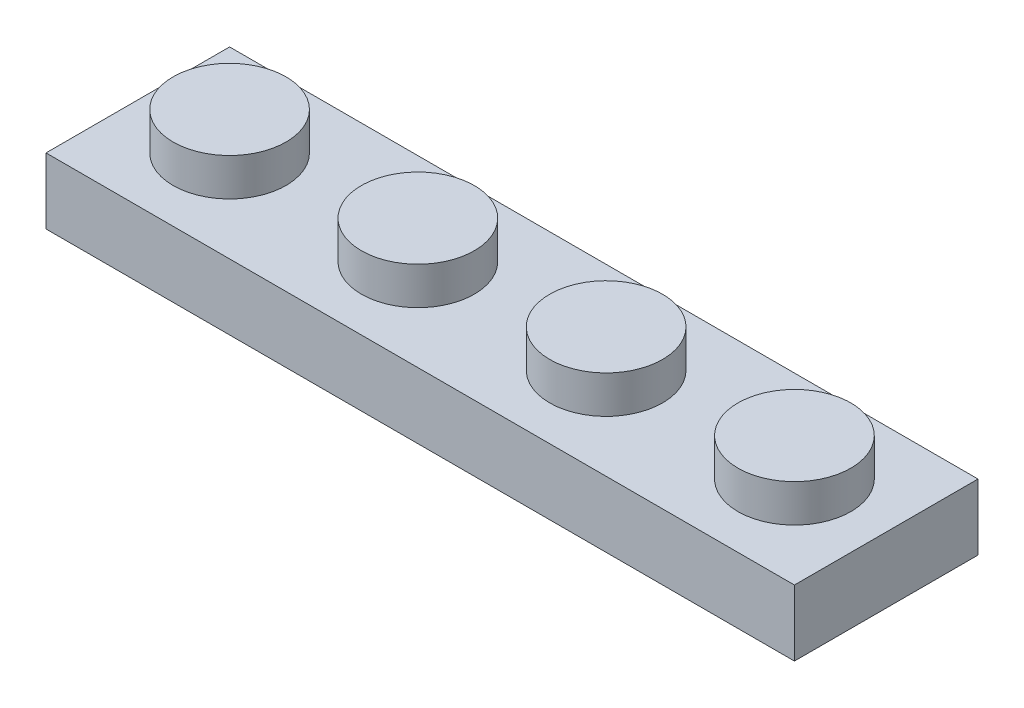
ISO-10303-21;
HEADER;
FILE_DESCRIPTION(('STEP AP214'),'2;1');
FILE_NAME('part.step','',(''),(''),'','','');
FILE_SCHEMA(('AUTOMOTIVE_DESIGN { 1 0 10303 214 1 1 1 1 }'));
ENDSEC;
DATA;
#1=APPLICATION_CONTEXT('core data for automotive mechanical design processes');
#2=APPLICATION_PROTOCOL_DEFINITION('international standard','automotive_design',2000,#1);
#3=PRODUCT_CONTEXT('',#1,'mechanical');
#4=PRODUCT('Part','Part','',(#3));
#5=PRODUCT_RELATED_PRODUCT_CATEGORY('part','',(#4));
#6=PRODUCT_DEFINITION_FORMATION('','',#4);
#7=PRODUCT_DEFINITION_CONTEXT('part definition',#1,'design');
#8=PRODUCT_DEFINITION('design','',#6,#7);
#9=PRODUCT_DEFINITION_SHAPE('','',#8);
#10=(LENGTH_UNIT() NAMED_UNIT(*) SI_UNIT(.MILLI.,.METRE.));
#11=(NAMED_UNIT(*) PLANE_ANGLE_UNIT() SI_UNIT($,.RADIAN.));
#12=(NAMED_UNIT(*) SI_UNIT($,.STERADIAN.) SOLID_ANGLE_UNIT());
#13=UNCERTAINTY_MEASURE_WITH_UNIT(LENGTH_MEASURE(1.E-05),#10,'distance_accuracy_value','');
#14=(GEOMETRIC_REPRESENTATION_CONTEXT(3) GLOBAL_UNCERTAINTY_ASSIGNED_CONTEXT((#13)) GLOBAL_UNIT_ASSIGNED_CONTEXT((#10,
#11,#12)) REPRESENTATION_CONTEXT('',''));
#15=CARTESIAN_POINT('',(0.,0.,0.));
#16=DIRECTION('',(0.,0.,1.));
#17=DIRECTION('',(1.,0.,0.));
#18=AXIS2_PLACEMENT_3D('',#15,#16,#17);
#19=CARTESIAN_POINT('',(0.,0.,-7.8));
#20=DIRECTION('',(0.,-1.,0.));
#21=DIRECTION('',(0.,0.,-1.));
#22=AXIS2_PLACEMENT_3D('',#19,#20,#21);
#23=PLANE('',#22);
#24=DIRECTION('',(1.,0.,0.));
#25=VECTOR('',#24,1.);
#26=CARTESIAN_POINT('',(0.,0.,0.));
#27=LINE('',#26,#25);
#28=CARTESIAN_POINT('',(0.,0.,0.));
#29=VERTEX_POINT('',#28);
#30=CARTESIAN_POINT('',(31.8,0.,0.));
#31=VERTEX_POINT('',#30);
#32=EDGE_CURVE('E223',#29,#31,#27,.T.);
#33=ORIENTED_EDGE('',*,*,#32,.F.);
#34=DIRECTION('',(0.,0.,1.));
#35=VECTOR('',#34,1.);
#36=CARTESIAN_POINT('',(0.,0.,-7.8));
#37=LINE('',#36,#35);
#38=CARTESIAN_POINT('',(0.,0.,-7.8));
#39=VERTEX_POINT('',#38);
#40=EDGE_CURVE('E94',#39,#29,#37,.T.);
#41=ORIENTED_EDGE('',*,*,#40,.F.);
#42=DIRECTION('',(1.,0.,0.));
#43=VECTOR('',#42,1.);
#44=CARTESIAN_POINT('',(0.,0.,-7.8));
#45=LINE('',#44,#43);
#46=CARTESIAN_POINT('',(31.8,0.,-7.8));
#47=VERTEX_POINT('',#46);
#48=EDGE_CURVE('E209',#39,#47,#45,.T.);
#49=ORIENTED_EDGE('',*,*,#48,.T.);
#50=DIRECTION('',(0.,0.,1.));
#51=VECTOR('',#50,1.);
#52=CARTESIAN_POINT('',(31.8,0.,-7.8));
#53=LINE('',#52,#51);
#54=EDGE_CURVE('E240',#47,#31,#53,.T.);
#55=ORIENTED_EDGE('',*,*,#54,.T.);
#56=EDGE_LOOP('',(#33,#41,#49,#55));
#57=FACE_BOUND('',#56,.T.);
#58=DIRECTION('',(0.,0.,1.));
#59=VECTOR('',#58,1.);
#60=CARTESIAN_POINT('',(0.5,0.,-7.8));
#61=LINE('',#60,#59);
#62=CARTESIAN_POINT('',(0.5,0.,-7.3));
#63=VERTEX_POINT('',#62);
#64=CARTESIAN_POINT('',(0.5,0.,-0.5));
#65=VERTEX_POINT('',#64);
#66=EDGE_CURVE('E142',#63,#65,#61,.T.);
#67=ORIENTED_EDGE('',*,*,#66,.T.);
#68=DIRECTION('',(1.,0.,0.));
#69=VECTOR('',#68,1.);
#70=CARTESIAN_POINT('',(0.,0.,-0.5));
#71=LINE('',#70,#69);
#72=CARTESIAN_POINT('',(31.3,0.,-0.5));
#73=VERTEX_POINT('',#72);
#74=EDGE_CURVE('E164',#65,#73,#71,.T.);
#75=ORIENTED_EDGE('',*,*,#74,.T.);
#76=DIRECTION('',(0.,0.,1.));
#77=VECTOR('',#76,1.);
#78=CARTESIAN_POINT('',(31.3,0.,-7.8));
#79=LINE('',#78,#77);
#80=CARTESIAN_POINT('',(31.3,0.,-7.3));
#81=VERTEX_POINT('',#80);
#82=EDGE_CURVE('E131',#81,#73,#79,.T.);
#83=ORIENTED_EDGE('',*,*,#82,.F.);
#84=DIRECTION('',(1.,0.,0.));
#85=VECTOR('',#84,1.);
#86=CARTESIAN_POINT('',(0.,0.,-7.3));
#87=LINE('',#86,#85);
#88=EDGE_CURVE('E59',#63,#81,#87,.T.);
#89=ORIENTED_EDGE('',*,*,#88,.F.);
#90=EDGE_LOOP('',(#67,#75,#83,#89));
#91=FACE_BOUND('',#90,.T.);
#92=ADVANCED_FACE('F43',(#57,#91),#23,.T.);
#93=CARTESIAN_POINT('',(27.9,4.4,-3.9));
#94=DIRECTION('',(0.,1.,0.));
#95=DIRECTION('',(0.,0.,1.));
#96=AXIS2_PLACEMENT_3D('',#93,#94,#95);
#97=PLANE('',#96);
#98=CARTESIAN_POINT('',(27.9,4.4,-3.9));
#99=DIRECTION('',(0.,1.,0.));
#100=DIRECTION('',(0.,0.,1.));
#101=AXIS2_PLACEMENT_3D('',#98,#99,#100);
#102=CIRCLE('',#101,2.4);
#103=CARTESIAN_POINT('',(27.9,4.4,-1.5));
#104=VERTEX_POINT('',#103);
#105=EDGE_CURVE('E256',#104,#104,#102,.T.);
#106=ORIENTED_EDGE('',*,*,#105,.T.);
#107=EDGE_LOOP('',(#106));
#108=FACE_BOUND('',#107,.T.);
#109=ADVANCED_FACE('F45',(#108),#97,.T.);
#110=CARTESIAN_POINT('',(27.9,4.4,-3.9));
#111=DIRECTION('',(0.,-1.,0.));
#112=DIRECTION('',(0.,0.,-1.));
#113=AXIS2_PLACEMENT_3D('',#110,#111,#112);
#114=CYLINDRICAL_SURFACE('',#113,2.4);
#115=ORIENTED_EDGE('',*,*,#105,.F.);
#116=EDGE_LOOP('',(#115));
#117=FACE_BOUND('',#116,.T.);
#118=CARTESIAN_POINT('',(27.9,2.8,-3.9));
#119=DIRECTION('',(0.,1.,0.));
#120=DIRECTION('',(0.,0.,1.));
#121=AXIS2_PLACEMENT_3D('',#118,#119,#120);
#122=CIRCLE('',#121,2.4);
#123=CARTESIAN_POINT('',(27.9,2.8,-1.5));
#124=VERTEX_POINT('',#123);
#125=EDGE_CURVE('E252',#124,#124,#122,.T.);
#126=ORIENTED_EDGE('',*,*,#125,.T.);
#127=EDGE_LOOP('',(#126));
#128=FACE_BOUND('',#127,.T.);
#129=ADVANCED_FACE('F300',(#117,#128),#114,.T.);
#130=CARTESIAN_POINT('',(19.9,4.4,-3.9));
#131=DIRECTION('',(0.,1.,0.));
#132=DIRECTION('',(0.,0.,1.));
#133=AXIS2_PLACEMENT_3D('',#130,#131,#132);
#134=PLANE('',#133);
#135=CARTESIAN_POINT('',(19.9,4.4,-3.9));
#136=DIRECTION('',(0.,1.,0.));
#137=DIRECTION('',(0.,0.,1.));
#138=AXIS2_PLACEMENT_3D('',#135,#136,#137);
#139=CIRCLE('',#138,2.4);
#140=CARTESIAN_POINT('',(19.9,4.4,-1.5));
#141=VERTEX_POINT('',#140);
#142=EDGE_CURVE('E248',#141,#141,#139,.T.);
#143=ORIENTED_EDGE('',*,*,#142,.T.);
#144=EDGE_LOOP('',(#143));
#145=FACE_BOUND('',#144,.T.);
#146=ADVANCED_FACE('F313',(#145),#134,.T.);
#147=CARTESIAN_POINT('',(19.9,4.4,-3.9));
#148=DIRECTION('',(0.,-1.,0.));
#149=DIRECTION('',(0.,0.,-1.));
#150=AXIS2_PLACEMENT_3D('',#147,#148,#149);
#151=CYLINDRICAL_SURFACE('',#150,2.4);
#152=ORIENTED_EDGE('',*,*,#142,.F.);
#153=EDGE_LOOP('',(#152));
#154=FACE_BOUND('',#153,.T.);
#155=CARTESIAN_POINT('',(19.9,2.8,-3.9));
#156=DIRECTION('',(0.,1.,0.));
#157=DIRECTION('',(0.,0.,1.));
#158=AXIS2_PLACEMENT_3D('',#155,#156,#157);
#159=CIRCLE('',#158,2.4);
#160=CARTESIAN_POINT('',(19.9,2.8,-1.5));
#161=VERTEX_POINT('',#160);
#162=EDGE_CURVE('E236',#161,#161,#159,.T.);
#163=ORIENTED_EDGE('',*,*,#162,.T.);
#164=EDGE_LOOP('',(#163));
#165=FACE_BOUND('',#164,.T.);
#166=ADVANCED_FACE('F310',(#154,#165),#151,.T.);
#167=CARTESIAN_POINT('',(0.,0.,-7.8));
#168=DIRECTION('',(-1.,0.,0.));
#169=DIRECTION('',(0.,0.,1.));
#170=AXIS2_PLACEMENT_3D('',#167,#168,#169);
#171=PLANE('',#170);
#172=DIRECTION('',(0.,-1.,0.));
#173=VECTOR('',#172,1.);
#174=CARTESIAN_POINT('',(0.,0.,0.));
#175=LINE('',#174,#173);
#176=CARTESIAN_POINT('',(0.,2.8,0.));
#177=VERTEX_POINT('',#176);
#178=EDGE_CURVE('E202',#177,#29,#175,.T.);
#179=ORIENTED_EDGE('',*,*,#178,.F.);
#180=DIRECTION('',(0.,0.,1.));
#181=VECTOR('',#180,1.);
#182=CARTESIAN_POINT('',(0.,2.8,-7.8));
#183=LINE('',#182,#181);
#184=CARTESIAN_POINT('',(0.,2.8,-7.8));
#185=VERTEX_POINT('',#184);
#186=EDGE_CURVE('E68',#185,#177,#183,.T.);
#187=ORIENTED_EDGE('',*,*,#186,.F.);
#188=DIRECTION('',(0.,-1.,0.));
#189=VECTOR('',#188,1.);
#190=CARTESIAN_POINT('',(0.,0.,-7.8));
#191=LINE('',#190,#189);
#192=EDGE_CURVE('E206',#185,#39,#191,.T.);
#193=ORIENTED_EDGE('',*,*,#192,.T.);
#194=ORIENTED_EDGE('',*,*,#40,.T.);
#195=EDGE_LOOP('',(#179,#187,#193,#194));
#196=FACE_BOUND('',#195,.T.);
#197=ADVANCED_FACE('F306',(#196),#171,.T.);
#198=CARTESIAN_POINT('',(0.,2.8,-7.8));
#199=DIRECTION('',(0.,1.,0.));
#200=DIRECTION('',(0.,0.,1.));
#201=AXIS2_PLACEMENT_3D('',#198,#199,#200);
#202=PLANE('',#201);
#203=CARTESIAN_POINT('',(11.9,2.8,-3.9));
#204=DIRECTION('',(0.,1.,0.));
#205=DIRECTION('',(0.,0.,1.));
#206=AXIS2_PLACEMENT_3D('',#203,#204,#205);
#207=CIRCLE('',#206,2.4);
#208=CARTESIAN_POINT('',(11.9,2.8,-1.5));
#209=VERTEX_POINT('',#208);
#210=EDGE_CURVE('E188',#209,#209,#207,.T.);
#211=ORIENTED_EDGE('',*,*,#210,.F.);
#212=EDGE_LOOP('',(#211));
#213=FACE_BOUND('',#212,.T.);
#214=CARTESIAN_POINT('',(3.9,2.8,-3.9));
#215=DIRECTION('',(0.,1.,0.));
#216=DIRECTION('',(0.,0.,1.));
#217=AXIS2_PLACEMENT_3D('',#214,#215,#216);
#218=CIRCLE('',#217,2.4);
#219=CARTESIAN_POINT('',(3.9,2.8,-1.5));
#220=VERTEX_POINT('',#219);
#221=EDGE_CURVE('E197',#220,#220,#218,.T.);
#222=ORIENTED_EDGE('',*,*,#221,.F.);
#223=EDGE_LOOP('',(#222));
#224=FACE_BOUND('',#223,.T.);
#225=DIRECTION('',(-1.,0.,0.));
#226=VECTOR('',#225,1.);
#227=CARTESIAN_POINT('',(0.,2.8,0.));
#228=LINE('',#227,#226);
#229=CARTESIAN_POINT('',(31.8,2.8,0.));
#230=VERTEX_POINT('',#229);
#231=EDGE_CURVE('E210',#230,#177,#228,.T.);
#232=ORIENTED_EDGE('',*,*,#231,.F.);
#233=DIRECTION('',(0.,0.,1.));
#234=VECTOR('',#233,1.);
#235=CARTESIAN_POINT('',(31.8,2.8,-7.8));
#236=LINE('',#235,#234);
#237=CARTESIAN_POINT('',(31.8,2.8,-7.8));
#238=VERTEX_POINT('',#237);
#239=EDGE_CURVE('E237',#238,#230,#236,.T.);
#240=ORIENTED_EDGE('',*,*,#239,.F.);
#241=DIRECTION('',(-1.,0.,0.));
#242=VECTOR('',#241,1.);
#243=CARTESIAN_POINT('',(0.,2.8,-7.8));
#244=LINE('',#243,#242);
#245=EDGE_CURVE('E217',#238,#185,#244,.T.);
#246=ORIENTED_EDGE('',*,*,#245,.T.);
#247=ORIENTED_EDGE('',*,*,#186,.T.);
#248=EDGE_LOOP('',(#232,#240,#246,#247));
#249=FACE_BOUND('',#248,.T.);
#250=ORIENTED_EDGE('',*,*,#162,.F.);
#251=EDGE_LOOP('',(#250));
#252=FACE_BOUND('',#251,.T.);
#253=ORIENTED_EDGE('',*,*,#125,.F.);
#254=EDGE_LOOP('',(#253));
#255=FACE_BOUND('',#254,.T.);
#256=ADVANCED_FACE('F309',(#213,#224,#249,#252,#255),#202,.T.);
#257=CARTESIAN_POINT('',(31.8,0.,-7.8));
#258=DIRECTION('',(1.,0.,0.));
#259=DIRECTION('',(0.,0.,-1.));
#260=AXIS2_PLACEMENT_3D('',#257,#258,#259);
#261=PLANE('',#260);
#262=DIRECTION('',(0.,1.,0.));
#263=VECTOR('',#262,1.);
#264=CARTESIAN_POINT('',(31.8,0.,0.));
#265=LINE('',#264,#263);
#266=EDGE_CURVE('E227',#31,#230,#265,.T.);
#267=ORIENTED_EDGE('',*,*,#266,.F.);
#268=ORIENTED_EDGE('',*,*,#54,.F.);
#269=DIRECTION('',(0.,1.,0.));
#270=VECTOR('',#269,1.);
#271=CARTESIAN_POINT('',(31.8,0.,-7.8));
#272=LINE('',#271,#270);
#273=EDGE_CURVE('E213',#47,#238,#272,.T.);
#274=ORIENTED_EDGE('',*,*,#273,.T.);
#275=ORIENTED_EDGE('',*,*,#239,.T.);
#276=EDGE_LOOP('',(#267,#268,#274,#275));
#277=FACE_BOUND('',#276,.T.);
#278=ADVANCED_FACE('F304',(#277),#261,.T.);
#279=CARTESIAN_POINT('',(0.,0.,-7.8));
#280=DIRECTION('',(0.,0.,-1.));
#281=DIRECTION('',(-1.,0.,0.));
#282=AXIS2_PLACEMENT_3D('',#279,#280,#281);
#283=PLANE('',#282);
#284=ORIENTED_EDGE('',*,*,#192,.F.);
#285=ORIENTED_EDGE('',*,*,#245,.F.);
#286=ORIENTED_EDGE('',*,*,#273,.F.);
#287=ORIENTED_EDGE('',*,*,#48,.F.);
#288=EDGE_LOOP('',(#284,#285,#286,#287));
#289=FACE_BOUND('',#288,.T.);
#290=ADVANCED_FACE('F330',(#289),#283,.T.);
#291=CARTESIAN_POINT('',(0.,0.,0.));
#292=DIRECTION('',(0.,0.,-1.));
#293=DIRECTION('',(-1.,0.,0.));
#294=AXIS2_PLACEMENT_3D('',#291,#292,#293);
#295=PLANE('',#294);
#296=ORIENTED_EDGE('',*,*,#178,.T.);
#297=ORIENTED_EDGE('',*,*,#32,.T.);
#298=ORIENTED_EDGE('',*,*,#266,.T.);
#299=ORIENTED_EDGE('',*,*,#231,.T.);
#300=EDGE_LOOP('',(#296,#297,#298,#299));
#301=FACE_BOUND('',#300,.T.);
#302=ADVANCED_FACE('F335',(#301),#295,.F.);
#303=CARTESIAN_POINT('',(3.9,4.4,-3.9));
#304=DIRECTION('',(0.,-1.,0.));
#305=DIRECTION('',(0.,0.,-1.));
#306=AXIS2_PLACEMENT_3D('',#303,#304,#305);
#307=CYLINDRICAL_SURFACE('',#306,2.4);
#308=CARTESIAN_POINT('',(3.9,4.4,-3.9));
#309=DIRECTION('',(0.,1.,0.));
#310=DIRECTION('',(0.,0.,1.));
#311=AXIS2_PLACEMENT_3D('',#308,#309,#310);
#312=CIRCLE('',#311,2.4);
#313=CARTESIAN_POINT('',(3.9,4.4,-1.5));
#314=VERTEX_POINT('',#313);
#315=EDGE_CURVE('E198',#314,#314,#312,.T.);
#316=ORIENTED_EDGE('',*,*,#315,.F.);
#317=EDGE_LOOP('',(#316));
#318=FACE_BOUND('',#317,.T.);
#319=ORIENTED_EDGE('',*,*,#221,.T.);
#320=EDGE_LOOP('',(#319));
#321=FACE_BOUND('',#320,.T.);
#322=ADVANCED_FACE('F338',(#318,#321),#307,.T.);
#323=CARTESIAN_POINT('',(3.9,4.4,-3.9));
#324=DIRECTION('',(0.,1.,0.));
#325=DIRECTION('',(0.,0.,1.));
#326=AXIS2_PLACEMENT_3D('',#323,#324,#325);
#327=PLANE('',#326);
#328=ORIENTED_EDGE('',*,*,#315,.T.);
#329=EDGE_LOOP('',(#328));
#330=FACE_BOUND('',#329,.T.);
#331=ADVANCED_FACE('F345',(#330),#327,.T.);
#332=CARTESIAN_POINT('',(11.9,4.4,-3.9));
#333=DIRECTION('',(0.,-1.,0.));
#334=DIRECTION('',(0.,0.,-1.));
#335=AXIS2_PLACEMENT_3D('',#332,#333,#334);
#336=CYLINDRICAL_SURFACE('',#335,2.4);
#337=CARTESIAN_POINT('',(11.9,4.4,-3.9));
#338=DIRECTION('',(0.,1.,0.));
#339=DIRECTION('',(0.,0.,1.));
#340=AXIS2_PLACEMENT_3D('',#337,#338,#339);
#341=CIRCLE('',#340,2.4);
#342=CARTESIAN_POINT('',(11.9,4.4,-1.5));
#343=VERTEX_POINT('',#342);
#344=EDGE_CURVE('E192',#343,#343,#341,.T.);
#345=ORIENTED_EDGE('',*,*,#344,.F.);
#346=EDGE_LOOP('',(#345));
#347=FACE_BOUND('',#346,.T.);
#348=ORIENTED_EDGE('',*,*,#210,.T.);
#349=EDGE_LOOP('',(#348));
#350=FACE_BOUND('',#349,.T.);
#351=ADVANCED_FACE('F349',(#347,#350),#336,.T.);
#352=CARTESIAN_POINT('',(11.9,4.4,-3.9));
#353=DIRECTION('',(0.,1.,0.));
#354=DIRECTION('',(0.,0.,1.));
#355=AXIS2_PLACEMENT_3D('',#352,#353,#354);
#356=PLANE('',#355);
#357=ORIENTED_EDGE('',*,*,#344,.T.);
#358=EDGE_LOOP('',(#357));
#359=FACE_BOUND('',#358,.T.);
#360=ADVANCED_FACE('F353',(#359),#356,.T.);
#361=CARTESIAN_POINT('',(27.9,3.9,-3.9));
#362=DIRECTION('',(0.,1.,0.));
#363=DIRECTION('',(0.,0.,1.));
#364=AXIS2_PLACEMENT_3D('',#361,#362,#363);
#365=PLANE('',#364);
#366=CARTESIAN_POINT('',(27.9,3.9,-3.9));
#367=DIRECTION('',(0.,1.,0.));
#368=DIRECTION('',(0.,0.,1.));
#369=AXIS2_PLACEMENT_3D('',#366,#367,#368);
#370=CIRCLE('',#369,1.9);
#371=CARTESIAN_POINT('',(27.9,3.9,-2.));
#372=VERTEX_POINT('',#371);
#373=EDGE_CURVE('E193',#372,#372,#370,.T.);
#374=ORIENTED_EDGE('',*,*,#373,.F.);
#375=EDGE_LOOP('',(#374));
#376=FACE_BOUND('',#375,.T.);
#377=ADVANCED_FACE('F357',(#376),#365,.F.);
#378=CARTESIAN_POINT('',(27.9,4.4,-3.9));
#379=DIRECTION('',(0.,-1.,0.));
#380=DIRECTION('',(0.,0.,-1.));
#381=AXIS2_PLACEMENT_3D('',#378,#379,#380);
#382=CYLINDRICAL_SURFACE('',#381,1.9);
#383=ORIENTED_EDGE('',*,*,#373,.T.);
#384=EDGE_LOOP('',(#383));
#385=FACE_BOUND('',#384,.T.);
#386=CARTESIAN_POINT('',(27.9,2.3,-3.9));
#387=DIRECTION('',(0.,1.,0.));
#388=DIRECTION('',(0.,0.,1.));
#389=AXIS2_PLACEMENT_3D('',#386,#387,#388);
#390=CIRCLE('',#389,1.9);
#391=CARTESIAN_POINT('',(27.9,2.3,-2.));
#392=VERTEX_POINT('',#391);
#393=EDGE_CURVE('E159',#392,#392,#390,.T.);
#394=ORIENTED_EDGE('',*,*,#393,.F.);
#395=EDGE_LOOP('',(#394));
#396=FACE_BOUND('',#395,.T.);
#397=ADVANCED_FACE('F391',(#385,#396),#382,.F.);
#398=CARTESIAN_POINT('',(19.9,3.9,-3.9));
#399=DIRECTION('',(0.,1.,0.));
#400=DIRECTION('',(0.,0.,1.));
#401=AXIS2_PLACEMENT_3D('',#398,#399,#400);
#402=PLANE('',#401);
#403=CARTESIAN_POINT('',(19.9,3.9,-3.9));
#404=DIRECTION('',(0.,1.,0.));
#405=DIRECTION('',(0.,0.,1.));
#406=AXIS2_PLACEMENT_3D('',#403,#404,#405);
#407=CIRCLE('',#406,1.9);
#408=CARTESIAN_POINT('',(19.9,3.9,-2.));
#409=VERTEX_POINT('',#408);
#410=EDGE_CURVE('E155',#409,#409,#407,.T.);
#411=ORIENTED_EDGE('',*,*,#410,.F.);
#412=EDGE_LOOP('',(#411));
#413=FACE_BOUND('',#412,.T.);
#414=ADVANCED_FACE('F387',(#413),#402,.F.);
#415=CARTESIAN_POINT('',(19.9,4.4,-3.9));
#416=DIRECTION('',(0.,-1.,0.));
#417=DIRECTION('',(0.,0.,-1.));
#418=AXIS2_PLACEMENT_3D('',#415,#416,#417);
#419=CYLINDRICAL_SURFACE('',#418,1.9);
#420=ORIENTED_EDGE('',*,*,#410,.T.);
#421=EDGE_LOOP('',(#420));
#422=FACE_BOUND('',#421,.T.);
#423=CARTESIAN_POINT('',(19.9,2.3,-3.9));
#424=DIRECTION('',(0.,1.,0.));
#425=DIRECTION('',(0.,0.,1.));
#426=AXIS2_PLACEMENT_3D('',#423,#424,#425);
#427=CIRCLE('',#426,1.9);
#428=CARTESIAN_POINT('',(19.9,2.3,-2.));
#429=VERTEX_POINT('',#428);
#430=EDGE_CURVE('E151',#429,#429,#427,.T.);
#431=ORIENTED_EDGE('',*,*,#430,.F.);
#432=EDGE_LOOP('',(#431));
#433=FACE_BOUND('',#432,.T.);
#434=ADVANCED_FACE('F384',(#422,#433),#419,.F.);
#435=CARTESIAN_POINT('',(0.5,0.,-7.8));
#436=DIRECTION('',(-1.,0.,0.));
#437=DIRECTION('',(0.,0.,1.));
#438=AXIS2_PLACEMENT_3D('',#435,#436,#437);
#439=PLANE('',#438);
#440=DIRECTION('',(0.,-1.,0.));
#441=VECTOR('',#440,1.);
#442=CARTESIAN_POINT('',(0.5,0.,-0.5));
#443=LINE('',#442,#441);
#444=CARTESIAN_POINT('',(0.5,2.3,-0.5));
#445=VERTEX_POINT('',#444);
#446=EDGE_CURVE('E160',#445,#65,#443,.T.);
#447=ORIENTED_EDGE('',*,*,#446,.T.);
#448=ORIENTED_EDGE('',*,*,#66,.F.);
#449=DIRECTION('',(0.,-1.,0.));
#450=VECTOR('',#449,1.);
#451=CARTESIAN_POINT('',(0.5,0.,-7.3));
#452=LINE('',#451,#450);
#453=CARTESIAN_POINT('',(0.5,2.3,-7.3));
#454=VERTEX_POINT('',#453);
#455=EDGE_CURVE('E166',#454,#63,#452,.T.);
#456=ORIENTED_EDGE('',*,*,#455,.F.);
#457=DIRECTION('',(0.,0.,1.));
#458=VECTOR('',#457,1.);
#459=CARTESIAN_POINT('',(0.5,2.3,-7.8));
#460=LINE('',#459,#458);
#461=EDGE_CURVE('E130',#454,#445,#460,.T.);
#462=ORIENTED_EDGE('',*,*,#461,.T.);
#463=EDGE_LOOP('',(#447,#448,#456,#462));
#464=FACE_BOUND('',#463,.T.);
#465=ADVANCED_FACE('F272',(#464),#439,.F.);
#466=CARTESIAN_POINT('',(0.,2.3,-7.8));
#467=DIRECTION('',(0.,1.,0.));
#468=DIRECTION('',(0.,0.,1.));
#469=AXIS2_PLACEMENT_3D('',#466,#467,#468);
#470=PLANE('',#469);
#471=CARTESIAN_POINT('',(23.9,2.3,-3.9));
#472=DIRECTION('',(0.,1.,0.));
#473=DIRECTION('',(0.,0.,1.));
#474=AXIS2_PLACEMENT_3D('',#471,#472,#473);
#475=CIRCLE('',#474,1.15);
#476=CARTESIAN_POINT('',(23.9,2.3,-2.75));
#477=VERTEX_POINT('',#476);
#478=EDGE_CURVE('E12',#477,#477,#475,.F.);
#479=ORIENTED_EDGE('',*,*,#478,.F.);
#480=EDGE_LOOP('',(#479));
#481=FACE_BOUND('',#480,.T.);
#482=CARTESIAN_POINT('',(15.9,2.3,-3.9));
#483=DIRECTION('',(0.,1.,0.));
#484=DIRECTION('',(0.,0.,1.));
#485=AXIS2_PLACEMENT_3D('',#482,#483,#484);
#486=CIRCLE('',#485,1.15);
#487=CARTESIAN_POINT('',(15.9,2.3,-2.75));
#488=VERTEX_POINT('',#487);
#489=EDGE_CURVE('E52',#488,#488,#486,.F.);
#490=ORIENTED_EDGE('',*,*,#489,.F.);
#491=EDGE_LOOP('',(#490));
#492=FACE_BOUND('',#491,.T.);
#493=CARTESIAN_POINT('',(7.9,2.3,-3.9));
#494=DIRECTION('',(0.,1.,0.));
#495=DIRECTION('',(0.,0.,1.));
#496=AXIS2_PLACEMENT_3D('',#493,#494,#495);
#497=CIRCLE('',#496,1.15);
#498=CARTESIAN_POINT('',(7.9,2.3,-2.75));
#499=VERTEX_POINT('',#498);
#500=EDGE_CURVE('E260',#499,#499,#497,.F.);
#501=ORIENTED_EDGE('',*,*,#500,.F.);
#502=EDGE_LOOP('',(#501));
#503=FACE_BOUND('',#502,.T.);
#504=CARTESIAN_POINT('',(11.9,2.3,-3.9));
#505=DIRECTION('',(0.,1.,0.));
#506=DIRECTION('',(0.,0.,1.));
#507=AXIS2_PLACEMENT_3D('',#504,#505,#506);
#508=CIRCLE('',#507,1.9);
#509=CARTESIAN_POINT('',(11.9,2.3,-2.));
#510=VERTEX_POINT('',#509);
#511=EDGE_CURVE('E179',#510,#510,#508,.T.);
#512=ORIENTED_EDGE('',*,*,#511,.T.);
#513=EDGE_LOOP('',(#512));
#514=FACE_BOUND('',#513,.T.);
#515=CARTESIAN_POINT('',(3.9,2.3,-3.9));
#516=DIRECTION('',(0.,1.,0.));
#517=DIRECTION('',(0.,0.,1.));
#518=AXIS2_PLACEMENT_3D('',#515,#516,#517);
#519=CIRCLE('',#518,1.9);
#520=CARTESIAN_POINT('',(3.9,2.3,-2.));
#521=VERTEX_POINT('',#520);
#522=EDGE_CURVE('E175',#521,#521,#519,.T.);
#523=ORIENTED_EDGE('',*,*,#522,.T.);
#524=EDGE_LOOP('',(#523));
#525=FACE_BOUND('',#524,.T.);
#526=DIRECTION('',(-1.,0.,0.));
#527=VECTOR('',#526,1.);
#528=CARTESIAN_POINT('',(0.,2.3,-0.5));
#529=LINE('',#528,#527);
#530=CARTESIAN_POINT('',(31.3,2.3,-0.5));
#531=VERTEX_POINT('',#530);
#532=EDGE_CURVE('E168',#531,#445,#529,.T.);
#533=ORIENTED_EDGE('',*,*,#532,.T.);
#534=ORIENTED_EDGE('',*,*,#461,.F.);
#535=DIRECTION('',(-1.,0.,0.));
#536=VECTOR('',#535,1.);
#537=CARTESIAN_POINT('',(0.,2.3,-7.3));
#538=LINE('',#537,#536);
#539=CARTESIAN_POINT('',(31.3,2.3,-7.3));
#540=VERTEX_POINT('',#539);
#541=EDGE_CURVE('E135',#540,#454,#538,.T.);
#542=ORIENTED_EDGE('',*,*,#541,.F.);
#543=DIRECTION('',(0.,0.,1.));
#544=VECTOR('',#543,1.);
#545=CARTESIAN_POINT('',(31.3,2.3,-7.8));
#546=LINE('',#545,#544);
#547=EDGE_CURVE('E119',#540,#531,#546,.T.);
#548=ORIENTED_EDGE('',*,*,#547,.T.);
#549=EDGE_LOOP('',(#533,#534,#542,#548));
#550=FACE_BOUND('',#549,.T.);
#551=ORIENTED_EDGE('',*,*,#430,.T.);
#552=EDGE_LOOP('',(#551));
#553=FACE_BOUND('',#552,.T.);
#554=ORIENTED_EDGE('',*,*,#393,.T.);
#555=EDGE_LOOP('',(#554));
#556=FACE_BOUND('',#555,.T.);
#557=ADVANCED_FACE('F138',(#481,#492,#503,#514,#525,#550,#553,#556),#470,.F.);
#558=CARTESIAN_POINT('',(31.3,0.,-7.8));
#559=DIRECTION('',(1.,0.,0.));
#560=DIRECTION('',(0.,0.,-1.));
#561=AXIS2_PLACEMENT_3D('',#558,#559,#560);
#562=PLANE('',#561);
#563=DIRECTION('',(0.,1.,0.));
#564=VECTOR('',#563,1.);
#565=CARTESIAN_POINT('',(31.3,0.,-0.5));
#566=LINE('',#565,#564);
#567=EDGE_CURVE('E124',#73,#531,#566,.T.);
#568=ORIENTED_EDGE('',*,*,#567,.T.);
#569=ORIENTED_EDGE('',*,*,#547,.F.);
#570=DIRECTION('',(0.,1.,0.));
#571=VECTOR('',#570,1.);
#572=CARTESIAN_POINT('',(31.3,0.,-7.3));
#573=LINE('',#572,#571);
#574=EDGE_CURVE('E121',#81,#540,#573,.T.);
#575=ORIENTED_EDGE('',*,*,#574,.F.);
#576=ORIENTED_EDGE('',*,*,#82,.T.);
#577=EDGE_LOOP('',(#568,#569,#575,#576));
#578=FACE_BOUND('',#577,.T.);
#579=ADVANCED_FACE('F120',(#578),#562,.F.);
#580=CARTESIAN_POINT('',(0.,0.,-7.3));
#581=DIRECTION('',(0.,0.,-1.));
#582=DIRECTION('',(-1.,0.,0.));
#583=AXIS2_PLACEMENT_3D('',#580,#581,#582);
#584=PLANE('',#583);
#585=ORIENTED_EDGE('',*,*,#455,.T.);
#586=ORIENTED_EDGE('',*,*,#88,.T.);
#587=ORIENTED_EDGE('',*,*,#574,.T.);
#588=ORIENTED_EDGE('',*,*,#541,.T.);
#589=EDGE_LOOP('',(#585,#586,#587,#588));
#590=FACE_BOUND('',#589,.T.);
#591=ADVANCED_FACE('F134',(#590),#584,.F.);
#592=CARTESIAN_POINT('',(0.,0.,-0.5));
#593=DIRECTION('',(0.,0.,-1.));
#594=DIRECTION('',(-1.,0.,0.));
#595=AXIS2_PLACEMENT_3D('',#592,#593,#594);
#596=PLANE('',#595);
#597=ORIENTED_EDGE('',*,*,#446,.F.);
#598=ORIENTED_EDGE('',*,*,#532,.F.);
#599=ORIENTED_EDGE('',*,*,#567,.F.);
#600=ORIENTED_EDGE('',*,*,#74,.F.);
#601=EDGE_LOOP('',(#597,#598,#599,#600));
#602=FACE_BOUND('',#601,.T.);
#603=ADVANCED_FACE('F292',(#602),#596,.T.);
#604=CARTESIAN_POINT('',(3.9,4.4,-3.9));
#605=DIRECTION('',(0.,-1.,0.));
#606=DIRECTION('',(0.,0.,-1.));
#607=AXIS2_PLACEMENT_3D('',#604,#605,#606);
#608=CYLINDRICAL_SURFACE('',#607,1.9);
#609=CARTESIAN_POINT('',(3.9,3.9,-3.9));
#610=DIRECTION('',(0.,1.,0.));
#611=DIRECTION('',(0.,0.,1.));
#612=AXIS2_PLACEMENT_3D('',#609,#610,#611);
#613=CIRCLE('',#612,1.9);
#614=CARTESIAN_POINT('',(3.9,3.9,-2.));
#615=VERTEX_POINT('',#614);
#616=EDGE_CURVE('E165',#615,#615,#613,.T.);
#617=ORIENTED_EDGE('',*,*,#616,.T.);
#618=EDGE_LOOP('',(#617));
#619=FACE_BOUND('',#618,.T.);
#620=ORIENTED_EDGE('',*,*,#522,.F.);
#621=EDGE_LOOP('',(#620));
#622=FACE_BOUND('',#621,.T.);
#623=ADVANCED_FACE('F371',(#619,#622),#608,.F.);
#624=CARTESIAN_POINT('',(3.9,3.9,-3.9));
#625=DIRECTION('',(0.,1.,0.));
#626=DIRECTION('',(0.,0.,1.));
#627=AXIS2_PLACEMENT_3D('',#624,#625,#626);
#628=PLANE('',#627);
#629=ORIENTED_EDGE('',*,*,#616,.F.);
#630=EDGE_LOOP('',(#629));
#631=FACE_BOUND('',#630,.T.);
#632=ADVANCED_FACE('F367',(#631),#628,.F.);
#633=CARTESIAN_POINT('',(11.9,4.4,-3.9));
#634=DIRECTION('',(0.,-1.,0.));
#635=DIRECTION('',(0.,0.,-1.));
#636=AXIS2_PLACEMENT_3D('',#633,#634,#635);
#637=CYLINDRICAL_SURFACE('',#636,1.9);
#638=CARTESIAN_POINT('',(11.9,3.9,-3.9));
#639=DIRECTION('',(0.,1.,0.));
#640=DIRECTION('',(0.,0.,1.));
#641=AXIS2_PLACEMENT_3D('',#638,#639,#640);
#642=CIRCLE('',#641,1.9);
#643=CARTESIAN_POINT('',(11.9,3.9,-2.));
#644=VERTEX_POINT('',#643);
#645=EDGE_CURVE('E176',#644,#644,#642,.T.);
#646=ORIENTED_EDGE('',*,*,#645,.T.);
#647=EDGE_LOOP('',(#646));
#648=FACE_BOUND('',#647,.T.);
#649=ORIENTED_EDGE('',*,*,#511,.F.);
#650=EDGE_LOOP('',(#649));
#651=FACE_BOUND('',#650,.T.);
#652=ADVANCED_FACE('F363',(#648,#651),#637,.F.);
#653=CARTESIAN_POINT('',(11.9,3.9,-3.9));
#654=DIRECTION('',(0.,1.,0.));
#655=DIRECTION('',(0.,0.,1.));
#656=AXIS2_PLACEMENT_3D('',#653,#654,#655);
#657=PLANE('',#656);
#658=ORIENTED_EDGE('',*,*,#645,.F.);
#659=EDGE_LOOP('',(#658));
#660=FACE_BOUND('',#659,.T.);
#661=ADVANCED_FACE('F359',(#660),#657,.F.);
#662=CARTESIAN_POINT('',(7.9,-3.25269119345812,-3.9));
#663=DIRECTION('',(0.,1.,0.));
#664=DIRECTION('',(0.,0.,1.));
#665=AXIS2_PLACEMENT_3D('',#662,#663,#664);
#666=CYLINDRICAL_SURFACE('',#665,1.15);
#667=ORIENTED_EDGE('',*,*,#500,.T.);
#668=EDGE_LOOP('',(#667));
#669=FACE_BOUND('',#668,.T.);
#670=CARTESIAN_POINT('',(7.9,0.2,-3.9));
#671=DIRECTION('',(0.,-1.,0.));
#672=DIRECTION('',(0.,0.,-1.));
#673=AXIS2_PLACEMENT_3D('',#670,#671,#672);
#674=CIRCLE('',#673,1.15);
#675=CARTESIAN_POINT('',(7.9,0.2,-5.05));
#676=VERTEX_POINT('',#675);
#677=EDGE_CURVE('E466',#676,#676,#674,.T.);
#678=ORIENTED_EDGE('',*,*,#677,.F.);
#679=EDGE_LOOP('',(#678));
#680=FACE_BOUND('',#679,.T.);
#681=ADVANCED_FACE('F362',(#669,#680),#666,.T.);
#682=CARTESIAN_POINT('',(7.9,-3.25269119345812,-3.9));
#683=DIRECTION('',(0.,1.,0.));
#684=DIRECTION('',(0.,0.,1.));
#685=AXIS2_PLACEMENT_3D('',#682,#683,#684);
#686=CYLINDRICAL_SURFACE('',#685,0.500000000000001);
#687=CARTESIAN_POINT('',(7.9,2.3,-3.9));
#688=DIRECTION('',(0.,-1.,0.));
#689=DIRECTION('',(0.,0.,-1.));
#690=AXIS2_PLACEMENT_3D('',#687,#688,#689);
#691=CIRCLE('',#690,0.500000000000001);
#692=CARTESIAN_POINT('',(7.9,2.3,-4.4));
#693=VERTEX_POINT('',#692);
#694=EDGE_CURVE('E470',#693,#693,#691,.T.);
#695=ORIENTED_EDGE('',*,*,#694,.F.);
#696=EDGE_LOOP('',(#695));
#697=FACE_BOUND('',#696,.T.);
#698=CARTESIAN_POINT('',(7.9,0.2,-3.9));
#699=DIRECTION('',(0.,-1.,0.));
#700=DIRECTION('',(0.,0.,-1.));
#701=AXIS2_PLACEMENT_3D('',#698,#699,#700);
#702=CIRCLE('',#701,0.500000000000001);
#703=CARTESIAN_POINT('',(7.9,0.2,-4.4));
#704=VERTEX_POINT('',#703);
#705=EDGE_CURVE('E462',#704,#704,#702,.T.);
#706=ORIENTED_EDGE('',*,*,#705,.T.);
#707=EDGE_LOOP('',(#706));
#708=FACE_BOUND('',#707,.T.);
#709=ADVANCED_FACE('F401',(#697,#708),#686,.F.);
#710=CARTESIAN_POINT('',(0.,0.2,-7.8));
#711=DIRECTION('',(0.,-1.,0.));
#712=DIRECTION('',(0.,0.,-1.));
#713=AXIS2_PLACEMENT_3D('',#710,#711,#712);
#714=PLANE('',#713);
#715=ORIENTED_EDGE('',*,*,#705,.F.);
#716=EDGE_LOOP('',(#715));
#717=FACE_BOUND('',#716,.T.);
#718=ORIENTED_EDGE('',*,*,#677,.T.);
#719=EDGE_LOOP('',(#718));
#720=FACE_BOUND('',#719,.T.);
#721=ADVANCED_FACE('F405',(#717,#720),#714,.T.);
#722=ORIENTED_EDGE('',*,*,#694,.T.);
#723=EDGE_LOOP('',(#722));
#724=FACE_BOUND('',#723,.T.);
#725=ADVANCED_FACE('F276',(#724),#470,.F.);
#726=CARTESIAN_POINT('',(15.9,-3.25269119345812,-3.9));
#727=DIRECTION('',(0.,1.,0.));
#728=DIRECTION('',(0.,0.,1.));
#729=AXIS2_PLACEMENT_3D('',#726,#727,#728);
#730=CYLINDRICAL_SURFACE('',#729,1.15);
#731=ORIENTED_EDGE('',*,*,#489,.T.);
#732=EDGE_LOOP('',(#731));
#733=FACE_BOUND('',#732,.T.);
#734=CARTESIAN_POINT('',(15.9,0.2,-3.9));
#735=DIRECTION('',(0.,-1.,0.));
#736=DIRECTION('',(0.,0.,-1.));
#737=AXIS2_PLACEMENT_3D('',#734,#735,#736);
#738=CIRCLE('',#737,1.15);
#739=CARTESIAN_POINT('',(15.9,0.2,-5.05));
#740=VERTEX_POINT('',#739);
#741=EDGE_CURVE('E458',#740,#740,#738,.T.);
#742=ORIENTED_EDGE('',*,*,#741,.F.);
#743=EDGE_LOOP('',(#742));
#744=FACE_BOUND('',#743,.T.);
#745=ADVANCED_FACE('F267',(#733,#744),#730,.T.);
#746=CARTESIAN_POINT('',(15.9,-3.25269119345812,-3.9));
#747=DIRECTION('',(0.,1.,0.));
#748=DIRECTION('',(0.,0.,1.));
#749=AXIS2_PLACEMENT_3D('',#746,#747,#748);
#750=CYLINDRICAL_SURFACE('',#749,0.500000000000001);
#751=CARTESIAN_POINT('',(15.9,2.3,-3.9));
#752=DIRECTION('',(0.,-1.,0.));
#753=DIRECTION('',(0.,0.,-1.));
#754=AXIS2_PLACEMENT_3D('',#751,#752,#753);
#755=CIRCLE('',#754,0.500000000000001);
#756=CARTESIAN_POINT('',(15.9,2.3,-4.4));
#757=VERTEX_POINT('',#756);
#758=EDGE_CURVE('E451',#757,#757,#755,.T.);
#759=ORIENTED_EDGE('',*,*,#758,.F.);
#760=EDGE_LOOP('',(#759));
#761=FACE_BOUND('',#760,.T.);
#762=CARTESIAN_POINT('',(15.9,0.2,-3.9));
#763=DIRECTION('',(0.,-1.,0.));
#764=DIRECTION('',(0.,0.,-1.));
#765=AXIS2_PLACEMENT_3D('',#762,#763,#764);
#766=CIRCLE('',#765,0.500000000000001);
#767=CARTESIAN_POINT('',(15.9,0.2,-4.4));
#768=VERTEX_POINT('',#767);
#769=EDGE_CURVE('E445',#768,#768,#766,.T.);
#770=ORIENTED_EDGE('',*,*,#769,.T.);
#771=EDGE_LOOP('',(#770));
#772=FACE_BOUND('',#771,.T.);
#773=ADVANCED_FACE('F412',(#761,#772),#750,.F.);
#774=CARTESIAN_POINT('',(0.,0.2,-7.8));
#775=DIRECTION('',(0.,-1.,0.));
#776=DIRECTION('',(0.,0.,-1.));
#777=AXIS2_PLACEMENT_3D('',#774,#775,#776);
#778=PLANE('',#777);
#779=ORIENTED_EDGE('',*,*,#769,.F.);
#780=EDGE_LOOP('',(#779));
#781=FACE_BOUND('',#780,.T.);
#782=ORIENTED_EDGE('',*,*,#741,.T.);
#783=EDGE_LOOP('',(#782));
#784=FACE_BOUND('',#783,.T.);
#785=ADVANCED_FACE('F415',(#781,#784),#778,.T.);
#786=ORIENTED_EDGE('',*,*,#758,.T.);
#787=EDGE_LOOP('',(#786));
#788=FACE_BOUND('',#787,.T.);
#789=ADVANCED_FACE('F419',(#788),#470,.F.);
#790=CARTESIAN_POINT('',(23.9,-3.25269119345812,-3.9));
#791=DIRECTION('',(0.,1.,0.));
#792=DIRECTION('',(0.,0.,1.));
#793=AXIS2_PLACEMENT_3D('',#790,#791,#792);
#794=CYLINDRICAL_SURFACE('',#793,1.15);
#795=ORIENTED_EDGE('',*,*,#478,.T.);
#796=EDGE_LOOP('',(#795));
#797=FACE_BOUND('',#796,.T.);
#798=CARTESIAN_POINT('',(23.9,0.2,-3.9));
#799=DIRECTION('',(0.,-1.,0.));
#800=DIRECTION('',(0.,0.,-1.));
#801=AXIS2_PLACEMENT_3D('',#798,#799,#800);
#802=CIRCLE('',#801,1.15);
#803=CARTESIAN_POINT('',(23.9,0.2,-5.05));
#804=VERTEX_POINT('',#803);
#805=EDGE_CURVE('E442',#804,#804,#802,.T.);
#806=ORIENTED_EDGE('',*,*,#805,.F.);
#807=EDGE_LOOP('',(#806));
#808=FACE_BOUND('',#807,.T.);
#809=ADVANCED_FACE('F421',(#797,#808),#794,.T.);
#810=CARTESIAN_POINT('',(23.9,-3.25269119345812,-3.9));
#811=DIRECTION('',(0.,1.,0.));
#812=DIRECTION('',(0.,0.,1.));
#813=AXIS2_PLACEMENT_3D('',#810,#811,#812);
#814=CYLINDRICAL_SURFACE('',#813,0.500000000000001);
#815=CARTESIAN_POINT('',(23.9,2.3,-3.9));
#816=DIRECTION('',(0.,-1.,0.));
#817=DIRECTION('',(0.,0.,-1.));
#818=AXIS2_PLACEMENT_3D('',#815,#816,#817);
#819=CIRCLE('',#818,0.500000000000001);
#820=CARTESIAN_POINT('',(23.9,2.3,-4.4));
#821=VERTEX_POINT('',#820);
#822=EDGE_CURVE('E446',#821,#821,#819,.T.);
#823=ORIENTED_EDGE('',*,*,#822,.F.);
#824=EDGE_LOOP('',(#823));
#825=FACE_BOUND('',#824,.T.);
#826=CARTESIAN_POINT('',(23.9,0.2,-3.9));
#827=DIRECTION('',(0.,-1.,0.));
#828=DIRECTION('',(0.,0.,-1.));
#829=AXIS2_PLACEMENT_3D('',#826,#827,#828);
#830=CIRCLE('',#829,0.500000000000001);
#831=CARTESIAN_POINT('',(23.9,0.2,-4.4));
#832=VERTEX_POINT('',#831);
#833=EDGE_CURVE('E439',#832,#832,#830,.T.);
#834=ORIENTED_EDGE('',*,*,#833,.T.);
#835=EDGE_LOOP('',(#834));
#836=FACE_BOUND('',#835,.T.);
#837=ADVANCED_FACE('F424',(#825,#836),#814,.F.);
#838=CARTESIAN_POINT('',(0.,0.2,-7.8));
#839=DIRECTION('',(0.,-1.,0.));
#840=DIRECTION('',(0.,0.,-1.));
#841=AXIS2_PLACEMENT_3D('',#838,#839,#840);
#842=PLANE('',#841);
#843=ORIENTED_EDGE('',*,*,#833,.F.);
#844=EDGE_LOOP('',(#843));
#845=FACE_BOUND('',#844,.T.);
#846=ORIENTED_EDGE('',*,*,#805,.T.);
#847=EDGE_LOOP('',(#846));
#848=FACE_BOUND('',#847,.T.);
#849=ADVANCED_FACE('F428',(#845,#848),#842,.T.);
#850=ORIENTED_EDGE('',*,*,#822,.T.);
#851=EDGE_LOOP('',(#850));
#852=FACE_BOUND('',#851,.T.);
#853=ADVANCED_FACE('F275',(#852),#470,.F.);
#854=CLOSED_SHELL('',(#92,#109,#129,#146,#166,#197,#256,#278,#290,#302,#322,#331,#351,#360,#377,
#397,#414,#434,#465,#557,#579,#591,#603,#623,#632,#652,#661,#681,#709,#721,#725,#745,#773,#785,
#789,#809,#837,#849,#853));
#855=MANIFOLD_SOLID_BREP('B2',#854);
#856=ADVANCED_BREP_SHAPE_REPRESENTATION('',(#18,#855),#14);
#857=SHAPE_DEFINITION_REPRESENTATION(#9,#856);
ENDSEC;
END-ISO-10303-21;
